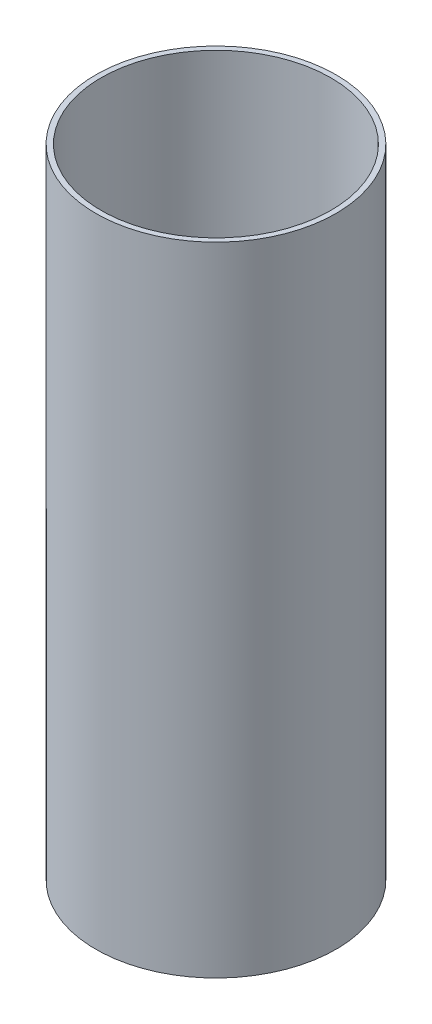
ISO-10303-21;
HEADER;
FILE_DESCRIPTION(('STEP AP214'),'2;1');
FILE_NAME('part.step','',(''),(''),'','','');
FILE_SCHEMA(('AUTOMOTIVE_DESIGN { 1 0 10303 214 1 1 1 1 }'));
ENDSEC;
DATA;
#1=APPLICATION_CONTEXT('core data for automotive mechanical design processes');
#2=APPLICATION_PROTOCOL_DEFINITION('international standard','automotive_design',2000,#1);
#3=PRODUCT_CONTEXT('',#1,'mechanical');
#4=PRODUCT('Part','Part','',(#3));
#5=PRODUCT_RELATED_PRODUCT_CATEGORY('part','',(#4));
#6=PRODUCT_DEFINITION_FORMATION('','',#4);
#7=PRODUCT_DEFINITION_CONTEXT('part definition',#1,'design');
#8=PRODUCT_DEFINITION('design','',#6,#7);
#9=PRODUCT_DEFINITION_SHAPE('','',#8);
#10=(LENGTH_UNIT() NAMED_UNIT(*) SI_UNIT(.MILLI.,.METRE.));
#11=(NAMED_UNIT(*) PLANE_ANGLE_UNIT() SI_UNIT($,.RADIAN.));
#12=(NAMED_UNIT(*) SI_UNIT($,.STERADIAN.) SOLID_ANGLE_UNIT());
#13=UNCERTAINTY_MEASURE_WITH_UNIT(LENGTH_MEASURE(1.E-05),#10,'distance_accuracy_value','');
#14=(GEOMETRIC_REPRESENTATION_CONTEXT(3) GLOBAL_UNCERTAINTY_ASSIGNED_CONTEXT((#13)) GLOBAL_UNIT_ASSIGNED_CONTEXT((#10,
#11,#12)) REPRESENTATION_CONTEXT('',''));
#15=CARTESIAN_POINT('',(0.,0.,0.));
#16=DIRECTION('',(0.,0.,1.));
#17=DIRECTION('',(1.,0.,0.));
#18=AXIS2_PLACEMENT_3D('',#15,#16,#17);
#19=CARTESIAN_POINT('',(0.,130.25,141.));
#20=DIRECTION('',(0.,-1.,0.));
#21=DIRECTION('',(0.,0.,-1.));
#22=AXIS2_PLACEMENT_3D('',#19,#20,#21);
#23=CYLINDRICAL_SURFACE('',#22,11.5);
#24=CARTESIAN_POINT('',(0.,130.25,141.));
#25=DIRECTION('',(0.,1.,0.));
#26=DIRECTION('',(0.,0.,1.));
#27=AXIS2_PLACEMENT_3D('',#24,#25,#26);
#28=CIRCLE('',#27,11.5);
#29=CARTESIAN_POINT('',(0.,130.25,129.5));
#30=VERTEX_POINT('',#29);
#31=EDGE_CURVE('E10',#30,#30,#28,.T.);
#32=CARTESIAN_POINT('',(0.,69.25,141.));
#33=DIRECTION('',(0.,1.,0.));
#34=DIRECTION('',(0.,0.,1.));
#35=AXIS2_PLACEMENT_3D('',#32,#33,#34);
#36=CIRCLE('',#35,11.5);
#37=CARTESIAN_POINT('',(0.,69.25,129.5));
#38=VERTEX_POINT('',#37);
#39=EDGE_CURVE('E37',#38,#38,#36,.T.);
#40=CARTESIAN_POINT('',(0.,130.25,129.5));
#41=CARTESIAN_POINT('',(0.,129.614583333333,129.5));
#42=CARTESIAN_POINT('',(0.,128.979166666667,129.5));
#43=CARTESIAN_POINT('',(0.,127.708333333333,129.5));
#44=CARTESIAN_POINT('',(0.,127.072916666667,129.5));
#45=CARTESIAN_POINT('',(0.,125.802083333333,129.5));
#46=CARTESIAN_POINT('',(0.,125.166666666667,129.5));
#47=CARTESIAN_POINT('',(0.,123.895833333333,129.5));
#48=CARTESIAN_POINT('',(0.,123.260416666667,129.5));
#49=CARTESIAN_POINT('',(0.,121.989583333333,129.5));
#50=CARTESIAN_POINT('',(0.,121.354166666667,129.5));
#51=CARTESIAN_POINT('',(0.,120.083333333333,129.5));
#52=CARTESIAN_POINT('',(0.,119.447916666667,129.5));
#53=CARTESIAN_POINT('',(0.,118.177083333333,129.5));
#54=CARTESIAN_POINT('',(0.,117.541666666667,129.5));
#55=CARTESIAN_POINT('',(0.,116.270833333333,129.5));
#56=CARTESIAN_POINT('',(0.,115.635416666667,129.5));
#57=CARTESIAN_POINT('',(0.,114.364583333333,129.5));
#58=CARTESIAN_POINT('',(0.,113.729166666667,129.5));
#59=CARTESIAN_POINT('',(0.,112.458333333333,129.5));
#60=CARTESIAN_POINT('',(0.,111.822916666667,129.5));
#61=CARTESIAN_POINT('',(0.,110.552083333333,129.5));
#62=CARTESIAN_POINT('',(0.,109.916666666667,129.5));
#63=CARTESIAN_POINT('',(0.,108.645833333333,129.5));
#64=CARTESIAN_POINT('',(0.,108.010416666667,129.5));
#65=CARTESIAN_POINT('',(0.,106.739583333333,129.5));
#66=CARTESIAN_POINT('',(0.,106.104166666667,129.5));
#67=CARTESIAN_POINT('',(0.,104.833333333333,129.5));
#68=CARTESIAN_POINT('',(0.,104.197916666667,129.5));
#69=CARTESIAN_POINT('',(0.,102.927083333333,129.5));
#70=CARTESIAN_POINT('',(0.,102.291666666667,129.5));
#71=CARTESIAN_POINT('',(0.,101.020833333333,129.5));
#72=CARTESIAN_POINT('',(0.,100.385416666667,129.5));
#73=CARTESIAN_POINT('',(0.,99.1145833333333,129.5));
#74=CARTESIAN_POINT('',(0.,98.4791666666667,129.5));
#75=CARTESIAN_POINT('',(0.,97.2083333333333,129.5));
#76=CARTESIAN_POINT('',(0.,96.5729166666667,129.5));
#77=CARTESIAN_POINT('',(0.,95.3020833333333,129.5));
#78=CARTESIAN_POINT('',(0.,94.6666666666667,129.5));
#79=CARTESIAN_POINT('',(0.,93.3958333333333,129.5));
#80=CARTESIAN_POINT('',(0.,92.7604166666667,129.5));
#81=CARTESIAN_POINT('',(0.,91.4895833333333,129.5));
#82=CARTESIAN_POINT('',(0.,90.8541666666667,129.5));
#83=CARTESIAN_POINT('',(0.,89.5833333333333,129.5));
#84=CARTESIAN_POINT('',(0.,88.9479166666667,129.5));
#85=CARTESIAN_POINT('',(0.,87.6770833333333,129.5));
#86=CARTESIAN_POINT('',(0.,87.0416666666667,129.5));
#87=CARTESIAN_POINT('',(0.,85.7708333333333,129.5));
#88=CARTESIAN_POINT('',(0.,85.1354166666667,129.5));
#89=CARTESIAN_POINT('',(0.,83.8645833333333,129.5));
#90=CARTESIAN_POINT('',(0.,83.2291666666667,129.5));
#91=CARTESIAN_POINT('',(0.,81.9583333333333,129.5));
#92=CARTESIAN_POINT('',(0.,81.3229166666667,129.5));
#93=CARTESIAN_POINT('',(0.,80.0520833333333,129.5));
#94=CARTESIAN_POINT('',(0.,79.4166666666667,129.5));
#95=CARTESIAN_POINT('',(0.,78.1458333333333,129.5));
#96=CARTESIAN_POINT('',(0.,77.5104166666667,129.5));
#97=CARTESIAN_POINT('',(0.,76.2395833333333,129.5));
#98=CARTESIAN_POINT('',(0.,75.6041666666667,129.5));
#99=CARTESIAN_POINT('',(0.,74.3333333333333,129.5));
#100=CARTESIAN_POINT('',(0.,73.6979166666667,129.5));
#101=CARTESIAN_POINT('',(0.,72.4270833333333,129.5));
#102=CARTESIAN_POINT('',(0.,71.7916666666667,129.5));
#103=CARTESIAN_POINT('',(0.,70.5208333333333,129.5));
#104=CARTESIAN_POINT('',(0.,69.8854166666667,129.5));
#105=CARTESIAN_POINT('',(0.,69.25,129.5));
#106=B_SPLINE_CURVE_WITH_KNOTS('',3,(#40,#41,#42,#43,#44,#45,#46,#47,#48,#49,#50,#51,#52,#53,
#54,#55,#56,#57,#58,#59,#60,#61,#62,#63,#64,#65,#66,#67,#68,#69,#70,#71,#72,#73,#74,#75,#76,#77,
#78,#79,#80,#81,#82,#83,#84,#85,#86,#87,#88,#89,#90,#91,#92,#93,#94,#95,#96,#97,#98,#99,#100,
#101,#102,#103,#104,#105),.UNSPECIFIED.,.F.,.F.,(4,2,2,2,2,2,2,2,2,2,2,2,2,2,2,2,2,2,2,2,2,2,2,
2,2,2,2,2,2,2,2,2,4),(0.,1.90625,3.8125,5.71874999999998,7.62499999999998,9.53124999999999,
11.4375,13.34375,15.25,17.15625,19.0625,20.96875,22.875,24.78125,26.6875,28.59375,30.5,32.40625,
34.3125,36.21875,38.125,40.03125,41.9375,43.84375,45.75,47.65625,49.5625,51.46875,53.375,
55.28125,57.1875,59.09375,61.),.UNSPECIFIED.);
#107=EDGE_CURVE('BSEAM34',#30,#38,#106,.T.);
#108=ORIENTED_EDGE('',*,*,#31,.F.);
#109=ORIENTED_EDGE('',*,*,#39,.T.);
#110=ORIENTED_EDGE('',*,*,#107,.T.);
#111=ORIENTED_EDGE('',*,*,#107,.F.);
#112=EDGE_LOOP('',(#108,#110,#109,#111));
#113=FACE_BOUND('',#112,.T.);
#114=ADVANCED_FACE('F34',(#113),#23,.T.);
#115=CARTESIAN_POINT('',(0.,130.25,141.));
#116=DIRECTION('',(0.,1.,0.));
#117=DIRECTION('',(0.,0.,1.));
#118=AXIS2_PLACEMENT_3D('',#115,#116,#117);
#119=PLANE('',#118);
#120=CARTESIAN_POINT('',(0.,130.25,141.));
#121=DIRECTION('',(0.,1.,0.));
#122=DIRECTION('',(0.,0.,1.));
#123=AXIS2_PLACEMENT_3D('',#120,#121,#122);
#124=CIRCLE('',#123,11.);
#125=CARTESIAN_POINT('',(0.,130.25,130.));
#126=VERTEX_POINT('',#125);
#127=EDGE_CURVE('E44',#126,#126,#124,.T.);
#128=ORIENTED_EDGE('',*,*,#127,.F.);
#129=EDGE_LOOP('',(#128));
#130=FACE_BOUND('',#129,.T.);
#131=ORIENTED_EDGE('',*,*,#31,.T.);
#132=EDGE_LOOP('',(#131));
#133=FACE_BOUND('',#132,.T.);
#134=ADVANCED_FACE('F55',(#130,#133),#119,.T.);
#135=CARTESIAN_POINT('',(0.,69.25,141.));
#136=DIRECTION('',(0.,1.,0.));
#137=DIRECTION('',(0.,0.,1.));
#138=AXIS2_PLACEMENT_3D('',#135,#136,#137);
#139=PLANE('',#138);
#140=CARTESIAN_POINT('',(0.,69.25,141.));
#141=DIRECTION('',(0.,1.,0.));
#142=DIRECTION('',(0.,0.,1.));
#143=AXIS2_PLACEMENT_3D('',#140,#141,#142);
#144=CIRCLE('',#143,11.);
#145=CARTESIAN_POINT('',(0.,69.25,130.));
#146=VERTEX_POINT('',#145);
#147=EDGE_CURVE('E46',#146,#146,#144,.T.);
#148=ORIENTED_EDGE('',*,*,#147,.T.);
#149=EDGE_LOOP('',(#148));
#150=FACE_BOUND('',#149,.T.);
#151=ORIENTED_EDGE('',*,*,#39,.F.);
#152=EDGE_LOOP('',(#151));
#153=FACE_BOUND('',#152,.T.);
#154=ADVANCED_FACE('F57',(#150,#153),#139,.F.);
#155=CARTESIAN_POINT('',(0.,130.25,141.));
#156=DIRECTION('',(0.,-1.,0.));
#157=DIRECTION('',(0.,0.,-1.));
#158=AXIS2_PLACEMENT_3D('',#155,#156,#157);
#159=CYLINDRICAL_SURFACE('',#158,11.);
#160=CARTESIAN_POINT('',(0.,130.25,130.));
#161=CARTESIAN_POINT('',(0.,129.614583333333,130.));
#162=CARTESIAN_POINT('',(0.,128.979166666667,130.));
#163=CARTESIAN_POINT('',(0.,127.708333333333,130.));
#164=CARTESIAN_POINT('',(0.,127.072916666667,130.));
#165=CARTESIAN_POINT('',(0.,125.802083333333,130.));
#166=CARTESIAN_POINT('',(0.,125.166666666667,130.));
#167=CARTESIAN_POINT('',(0.,123.895833333333,130.));
#168=CARTESIAN_POINT('',(0.,123.260416666667,130.));
#169=CARTESIAN_POINT('',(0.,121.989583333333,130.));
#170=CARTESIAN_POINT('',(0.,121.354166666667,130.));
#171=CARTESIAN_POINT('',(0.,120.083333333333,130.));
#172=CARTESIAN_POINT('',(0.,119.447916666667,130.));
#173=CARTESIAN_POINT('',(0.,118.177083333333,130.));
#174=CARTESIAN_POINT('',(0.,117.541666666667,130.));
#175=CARTESIAN_POINT('',(0.,116.270833333333,130.));
#176=CARTESIAN_POINT('',(0.,115.635416666667,130.));
#177=CARTESIAN_POINT('',(0.,114.364583333333,130.));
#178=CARTESIAN_POINT('',(0.,113.729166666667,130.));
#179=CARTESIAN_POINT('',(0.,112.458333333333,130.));
#180=CARTESIAN_POINT('',(0.,111.822916666667,130.));
#181=CARTESIAN_POINT('',(0.,110.552083333333,130.));
#182=CARTESIAN_POINT('',(0.,109.916666666667,130.));
#183=CARTESIAN_POINT('',(0.,108.645833333333,130.));
#184=CARTESIAN_POINT('',(0.,108.010416666667,130.));
#185=CARTESIAN_POINT('',(0.,106.739583333333,130.));
#186=CARTESIAN_POINT('',(0.,106.104166666667,130.));
#187=CARTESIAN_POINT('',(0.,104.833333333333,130.));
#188=CARTESIAN_POINT('',(0.,104.197916666667,130.));
#189=CARTESIAN_POINT('',(0.,102.927083333333,130.));
#190=CARTESIAN_POINT('',(0.,102.291666666667,130.));
#191=CARTESIAN_POINT('',(0.,101.020833333333,130.));
#192=CARTESIAN_POINT('',(0.,100.385416666667,130.));
#193=CARTESIAN_POINT('',(0.,99.1145833333333,130.));
#194=CARTESIAN_POINT('',(0.,98.4791666666667,130.));
#195=CARTESIAN_POINT('',(0.,97.2083333333333,130.));
#196=CARTESIAN_POINT('',(0.,96.5729166666667,130.));
#197=CARTESIAN_POINT('',(0.,95.3020833333333,130.));
#198=CARTESIAN_POINT('',(0.,94.6666666666667,130.));
#199=CARTESIAN_POINT('',(0.,93.3958333333333,130.));
#200=CARTESIAN_POINT('',(0.,92.7604166666667,130.));
#201=CARTESIAN_POINT('',(0.,91.4895833333333,130.));
#202=CARTESIAN_POINT('',(0.,90.8541666666667,130.));
#203=CARTESIAN_POINT('',(0.,89.5833333333333,130.));
#204=CARTESIAN_POINT('',(0.,88.9479166666667,130.));
#205=CARTESIAN_POINT('',(0.,87.6770833333333,130.));
#206=CARTESIAN_POINT('',(0.,87.0416666666667,130.));
#207=CARTESIAN_POINT('',(0.,85.7708333333333,130.));
#208=CARTESIAN_POINT('',(0.,85.1354166666667,130.));
#209=CARTESIAN_POINT('',(0.,83.8645833333333,130.));
#210=CARTESIAN_POINT('',(0.,83.2291666666667,130.));
#211=CARTESIAN_POINT('',(0.,81.9583333333333,130.));
#212=CARTESIAN_POINT('',(0.,81.3229166666667,130.));
#213=CARTESIAN_POINT('',(0.,80.0520833333333,130.));
#214=CARTESIAN_POINT('',(0.,79.4166666666667,130.));
#215=CARTESIAN_POINT('',(0.,78.1458333333333,130.));
#216=CARTESIAN_POINT('',(0.,77.5104166666667,130.));
#217=CARTESIAN_POINT('',(0.,76.2395833333333,130.));
#218=CARTESIAN_POINT('',(0.,75.6041666666667,130.));
#219=CARTESIAN_POINT('',(0.,74.3333333333333,130.));
#220=CARTESIAN_POINT('',(0.,73.6979166666667,130.));
#221=CARTESIAN_POINT('',(0.,72.4270833333333,130.));
#222=CARTESIAN_POINT('',(0.,71.7916666666667,130.));
#223=CARTESIAN_POINT('',(0.,70.5208333333333,130.));
#224=CARTESIAN_POINT('',(0.,69.8854166666667,130.));
#225=CARTESIAN_POINT('',(0.,69.25,130.));
#226=B_SPLINE_CURVE_WITH_KNOTS('',3,(#160,#161,#162,#163,#164,#165,#166,#167,#168,#169,#170,
#171,#172,#173,#174,#175,#176,#177,#178,#179,#180,#181,#182,#183,#184,#185,#186,#187,#188,#189,
#190,#191,#192,#193,#194,#195,#196,#197,#198,#199,#200,#201,#202,#203,#204,#205,#206,#207,#208,
#209,#210,#211,#212,#213,#214,#215,#216,#217,#218,#219,#220,#221,#222,#223,#224,#225),
.UNSPECIFIED.,.F.,.F.,(4,2,2,2,2,2,2,2,2,2,2,2,2,2,2,2,2,2,2,2,2,2,2,2,2,2,2,2,2,2,2,2,4),(0.,
1.90625000000003,3.81250000000002,5.71875000000001,7.62500000000001,9.53125000000002,11.4375,
13.34375,15.25,17.15625,19.0625,20.96875,22.875,24.78125,26.6875,28.59375,30.5,32.40625,34.3125,
36.21875,38.125,40.03125,41.9375,43.84375,45.75,47.65625,49.5625,51.46875,53.375,55.28125,
57.1875,59.09375,61.),.UNSPECIFIED.);
#227=EDGE_CURVE('BSEAM52',#126,#146,#226,.T.);
#228=ORIENTED_EDGE('',*,*,#127,.T.);
#229=ORIENTED_EDGE('',*,*,#147,.F.);
#230=ORIENTED_EDGE('',*,*,#227,.T.);
#231=ORIENTED_EDGE('',*,*,#227,.F.);
#232=EDGE_LOOP('',(#228,#230,#229,#231));
#233=FACE_BOUND('',#232,.T.);
#234=ADVANCED_FACE('F52',(#233),#159,.F.);
#235=CLOSED_SHELL('',(#114,#134,#154,#234));
#236=MANIFOLD_SOLID_BREP('B2',#235);
#237=ADVANCED_BREP_SHAPE_REPRESENTATION('',(#18,#236),#14);
#238=SHAPE_DEFINITION_REPRESENTATION(#9,#237);
ENDSEC;
END-ISO-10303-21;
